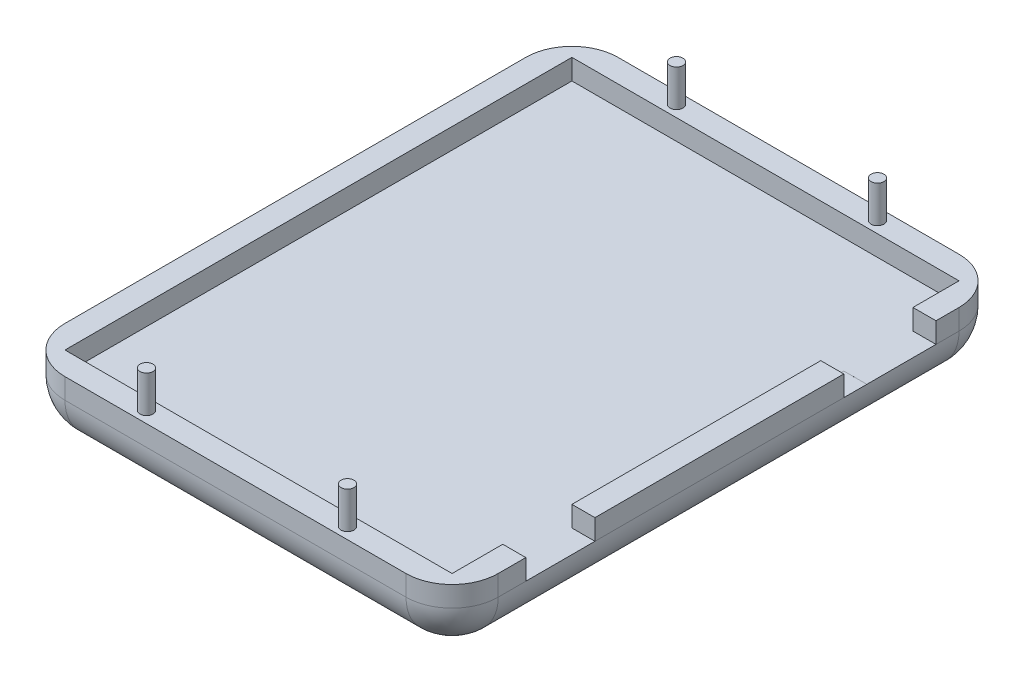
ISO-10303-21;
HEADER;
FILE_DESCRIPTION(('STEP AP214'),'2;1');
FILE_NAME('part.step','',(''),(''),'','','');
FILE_SCHEMA(('AUTOMOTIVE_DESIGN { 1 0 10303 214 1 1 1 1 }'));
ENDSEC;
DATA;
#1=APPLICATION_CONTEXT('core data for automotive mechanical design processes');
#2=APPLICATION_PROTOCOL_DEFINITION('international standard','automotive_design',2000,#1);
#3=PRODUCT_CONTEXT('',#1,'mechanical');
#4=PRODUCT('Part','Part','',(#3));
#5=PRODUCT_RELATED_PRODUCT_CATEGORY('part','',(#4));
#6=PRODUCT_DEFINITION_FORMATION('','',#4);
#7=PRODUCT_DEFINITION_CONTEXT('part definition',#1,'design');
#8=PRODUCT_DEFINITION('design','',#6,#7);
#9=PRODUCT_DEFINITION_SHAPE('','',#8);
#10=(LENGTH_UNIT() NAMED_UNIT(*) SI_UNIT(.MILLI.,.METRE.));
#11=(NAMED_UNIT(*) PLANE_ANGLE_UNIT() SI_UNIT($,.RADIAN.));
#12=(NAMED_UNIT(*) SI_UNIT($,.STERADIAN.) SOLID_ANGLE_UNIT());
#13=UNCERTAINTY_MEASURE_WITH_UNIT(LENGTH_MEASURE(1.E-05),#10,'distance_accuracy_value','');
#14=(GEOMETRIC_REPRESENTATION_CONTEXT(3) GLOBAL_UNCERTAINTY_ASSIGNED_CONTEXT((#13)) GLOBAL_UNIT_ASSIGNED_CONTEXT((#10,
#11,#12)) REPRESENTATION_CONTEXT('',''));
#15=CARTESIAN_POINT('',(0.,0.,0.));
#16=DIRECTION('',(0.,0.,1.));
#17=DIRECTION('',(1.,0.,0.));
#18=AXIS2_PLACEMENT_3D('',#15,#16,#17);
#19=CARTESIAN_POINT('',(84.,10.,120.));
#20=DIRECTION('',(0.,0.,1.));
#21=DIRECTION('',(1.,0.,0.));
#22=AXIS2_PLACEMENT_3D('',#19,#20,#21);
#23=CYLINDRICAL_SURFACE('',#22,10.);
#24=DIRECTION('',(0.,0.,-1.));
#25=VECTOR('',#24,1.);
#26=CARTESIAN_POINT('',(94.,10.,9.99999999999999));
#27=LINE('',#26,#25);
#28=CARTESIAN_POINT('',(94.,10.,89.));
#29=VERTEX_POINT('',#28);
#30=CARTESIAN_POINT('',(94.,10.,35.));
#31=VERTEX_POINT('',#30);
#32=EDGE_CURVE('E57',#29,#31,#27,.T.);
#33=ORIENTED_EDGE('',*,*,#32,.F.);
#34=DIRECTION('',(0.,0.,-1.));
#35=VECTOR('',#34,1.);
#36=CARTESIAN_POINT('',(94.,10.,120.));
#37=LINE('',#36,#35);
#38=CARTESIAN_POINT('',(94.,10.,104.));
#39=VERTEX_POINT('',#38);
#40=EDGE_CURVE('E336',#39,#29,#37,.T.);
#41=ORIENTED_EDGE('',*,*,#40,.F.);
#42=DIRECTION('',(0.,0.,-1.));
#43=VECTOR('',#42,1.);
#44=CARTESIAN_POINT('',(94.,10.,9.99999999999999));
#45=LINE('',#44,#43);
#46=CARTESIAN_POINT('',(94.,10.,110.));
#47=VERTEX_POINT('',#46);
#48=EDGE_CURVE('E410',#47,#39,#45,.T.);
#49=ORIENTED_EDGE('',*,*,#48,.F.);
#50=CARTESIAN_POINT('',(84.,10.,110.));
#51=DIRECTION('',(0.,0.,-1.));
#52=DIRECTION('',(-1.,0.,0.));
#53=AXIS2_PLACEMENT_3D('',#50,#51,#52);
#54=CIRCLE('',#53,10.);
#55=CARTESIAN_POINT('',(84.,0.,110.));
#56=VERTEX_POINT('',#55);
#57=EDGE_CURVE('E435',#47,#56,#54,.T.);
#58=ORIENTED_EDGE('',*,*,#57,.T.);
#59=DIRECTION('',(0.,0.,-1.));
#60=VECTOR('',#59,1.);
#61=CARTESIAN_POINT('',(84.,0.,110.));
#62=LINE('',#61,#60);
#63=CARTESIAN_POINT('',(84.,0.,9.99999999999999));
#64=VERTEX_POINT('',#63);
#65=EDGE_CURVE('E390',#64,#56,#62,.F.);
#66=ORIENTED_EDGE('',*,*,#65,.F.);
#67=CARTESIAN_POINT('',(84.,10.,9.99999999999999));
#68=DIRECTION('',(0.,0.,-1.));
#69=DIRECTION('',(-1.,0.,0.));
#70=AXIS2_PLACEMENT_3D('',#67,#68,#69);
#71=CIRCLE('',#70,10.);
#72=CARTESIAN_POINT('',(94.,10.,9.99999999999999));
#73=VERTEX_POINT('',#72);
#74=EDGE_CURVE('E429',#73,#64,#71,.T.);
#75=ORIENTED_EDGE('',*,*,#74,.F.);
#76=DIRECTION('',(0.,0.,-1.));
#77=VECTOR('',#76,1.);
#78=CARTESIAN_POINT('',(94.,10.,9.99999999999999));
#79=LINE('',#78,#77);
#80=CARTESIAN_POINT('',(94.,10.,15.));
#81=VERTEX_POINT('',#80);
#82=EDGE_CURVE('E407',#81,#73,#79,.T.);
#83=ORIENTED_EDGE('',*,*,#82,.F.);
#84=DIRECTION('',(0.,0.,1.));
#85=VECTOR('',#84,1.);
#86=CARTESIAN_POINT('',(94.,10.,120.));
#87=LINE('',#86,#85);
#88=CARTESIAN_POINT('',(94.,10.,30.));
#89=VERTEX_POINT('',#88);
#90=EDGE_CURVE('E327',#81,#89,#87,.T.);
#91=ORIENTED_EDGE('',*,*,#90,.T.);
#92=DIRECTION('',(0.,1.,0.));
#93=VECTOR('',#92,1.);
#94=CARTESIAN_POINT('',(94.,9.99645236657145,30.));
#95=LINE('',#94,#93);
#96=CARTESIAN_POINT('',(94.,9.99645236657145,30.));
#97=VERTEX_POINT('',#96);
#98=EDGE_CURVE('E248',#97,#89,#95,.T.);
#99=ORIENTED_EDGE('',*,*,#98,.F.);
#100=DIRECTION('',(0.,0.,1.));
#101=VECTOR('',#100,1.);
#102=CARTESIAN_POINT('',(94.,9.99645236657145,30.));
#103=LINE('',#102,#101);
#104=CARTESIAN_POINT('',(94.,9.99645236657145,35.));
#105=VERTEX_POINT('',#104);
#106=EDGE_CURVE('E237',#97,#105,#103,.T.);
#107=ORIENTED_EDGE('',*,*,#106,.T.);
#108=DIRECTION('',(0.,1.,0.));
#109=VECTOR('',#108,1.);
#110=CARTESIAN_POINT('',(94.,9.99645236657145,35.));
#111=LINE('',#110,#109);
#112=EDGE_CURVE('E250',#105,#31,#111,.T.);
#113=ORIENTED_EDGE('',*,*,#112,.T.);
#114=EDGE_LOOP('',(#33,#41,#49,#58,#66,#75,#83,#91,#99,#107,#113));
#115=FACE_BOUND('',#114,.T.);
#116=ADVANCED_FACE('F35',(#115),#23,.T.);
#117=CARTESIAN_POINT('',(94.,30.,120.));
#118=DIRECTION('',(1.,0.,0.));
#119=DIRECTION('',(0.,0.,-1.));
#120=AXIS2_PLACEMENT_3D('',#117,#118,#119);
#121=PLANE('',#120);
#122=DIRECTION('',(0.,-1.,0.));
#123=VECTOR('',#122,1.);
#124=CARTESIAN_POINT('',(94.,30.,104.));
#125=LINE('',#124,#123);
#126=CARTESIAN_POINT('',(94.,14.4464523665714,104.));
#127=VERTEX_POINT('',#126);
#128=EDGE_CURVE('E338',#127,#39,#125,.T.);
#129=ORIENTED_EDGE('',*,*,#128,.F.);
#130=DIRECTION('',(0.,0.,1.));
#131=VECTOR('',#130,1.);
#132=CARTESIAN_POINT('',(94.,14.4464523665714,120.));
#133=LINE('',#132,#131);
#134=CARTESIAN_POINT('',(94.,14.4464523665714,110.));
#135=VERTEX_POINT('',#134);
#136=EDGE_CURVE('E296',#127,#135,#133,.T.);
#137=ORIENTED_EDGE('',*,*,#136,.T.);
#138=DIRECTION('',(0.,-1.,0.));
#139=VECTOR('',#138,1.);
#140=CARTESIAN_POINT('',(94.,0.,110.));
#141=LINE('',#140,#139);
#142=EDGE_CURVE('E381',#135,#47,#141,.T.);
#143=ORIENTED_EDGE('',*,*,#142,.T.);
#144=ORIENTED_EDGE('',*,*,#48,.T.);
#145=EDGE_LOOP('',(#129,#137,#143,#144));
#146=FACE_BOUND('',#145,.T.);
#147=ADVANCED_FACE('F506',(#146),#121,.T.);
#148=CARTESIAN_POINT('',(94.,14.4464523665714,35.));
#149=VERTEX_POINT('',#148);
#150=EDGE_CURVE('E210',#31,#149,#111,.T.);
#151=ORIENTED_EDGE('',*,*,#150,.T.);
#152=DIRECTION('',(0.,0.,1.));
#153=VECTOR('',#152,1.);
#154=CARTESIAN_POINT('',(94.,14.4464523665714,120.));
#155=LINE('',#154,#153);
#156=CARTESIAN_POINT('',(94.,14.4464523665714,89.));
#157=VERTEX_POINT('',#156);
#158=EDGE_CURVE('E206',#149,#157,#155,.T.);
#159=ORIENTED_EDGE('',*,*,#158,.T.);
#160=DIRECTION('',(0.,1.,0.));
#161=VECTOR('',#160,1.);
#162=CARTESIAN_POINT('',(94.,9.99645236657145,89.));
#163=LINE('',#162,#161);
#164=EDGE_CURVE('E209',#29,#157,#163,.T.);
#165=ORIENTED_EDGE('',*,*,#164,.F.);
#166=ORIENTED_EDGE('',*,*,#32,.T.);
#167=EDGE_LOOP('',(#151,#159,#165,#166));
#168=FACE_BOUND('',#167,.T.);
#169=ADVANCED_FACE('F208',(#168),#121,.T.);
#170=CARTESIAN_POINT('',(89.,10.,115.));
#171=DIRECTION('',(1.,0.,0.));
#172=DIRECTION('',(0.,0.,-1.));
#173=AXIS2_PLACEMENT_3D('',#170,#171,#172);
#174=PLANE('',#173);
#175=DIRECTION('',(0.,0.,1.));
#176=VECTOR('',#175,1.);
#177=CARTESIAN_POINT('',(89.,14.4464523665714,115.));
#178=LINE('',#177,#176);
#179=CARTESIAN_POINT('',(89.,14.4464523665714,5.));
#180=VERTEX_POINT('',#179);
#181=CARTESIAN_POINT('',(89.,14.4464523665714,15.));
#182=VERTEX_POINT('',#181);
#183=EDGE_CURVE('E282',#180,#182,#178,.T.);
#184=ORIENTED_EDGE('',*,*,#183,.F.);
#185=DIRECTION('',(0.,1.,0.));
#186=VECTOR('',#185,1.);
#187=CARTESIAN_POINT('',(89.,10.,5.));
#188=LINE('',#187,#186);
#189=CARTESIAN_POINT('',(89.,10.,5.));
#190=VERTEX_POINT('',#189);
#191=EDGE_CURVE('E359',#190,#180,#188,.T.);
#192=ORIENTED_EDGE('',*,*,#191,.F.);
#193=DIRECTION('',(0.,0.,-1.));
#194=VECTOR('',#193,1.);
#195=CARTESIAN_POINT('',(89.,10.,115.));
#196=LINE('',#195,#194);
#197=CARTESIAN_POINT('',(89.,10.,15.));
#198=VERTEX_POINT('',#197);
#199=EDGE_CURVE('E346',#198,#190,#196,.T.);
#200=ORIENTED_EDGE('',*,*,#199,.F.);
#201=DIRECTION('',(0.,1.,0.));
#202=VECTOR('',#201,1.);
#203=CARTESIAN_POINT('',(89.,10.,15.));
#204=LINE('',#203,#202);
#205=EDGE_CURVE('E321',#198,#182,#204,.T.);
#206=ORIENTED_EDGE('',*,*,#205,.T.);
#207=EDGE_LOOP('',(#184,#192,#200,#206));
#208=FACE_BOUND('',#207,.T.);
#209=ADVANCED_FACE('F516',(#208),#174,.F.);
#210=DIRECTION('',(0.,-1.,0.));
#211=VECTOR('',#210,1.);
#212=CARTESIAN_POINT('',(94.,30.,9.99999999999999));
#213=LINE('',#212,#211);
#214=CARTESIAN_POINT('',(94.,14.4464523665714,9.99999999999999));
#215=VERTEX_POINT('',#214);
#216=EDGE_CURVE('E378',#73,#215,#213,.F.);
#217=ORIENTED_EDGE('',*,*,#216,.T.);
#218=DIRECTION('',(0.,0.,1.));
#219=VECTOR('',#218,1.);
#220=CARTESIAN_POINT('',(94.,14.4464523665714,120.));
#221=LINE('',#220,#219);
#222=CARTESIAN_POINT('',(94.,14.4464523665714,15.));
#223=VERTEX_POINT('',#222);
#224=EDGE_CURVE('E277',#215,#223,#221,.T.);
#225=ORIENTED_EDGE('',*,*,#224,.T.);
#226=DIRECTION('',(0.,1.,0.));
#227=VECTOR('',#226,1.);
#228=CARTESIAN_POINT('',(94.,30.,15.));
#229=LINE('',#228,#227);
#230=EDGE_CURVE('E324',#81,#223,#229,.T.);
#231=ORIENTED_EDGE('',*,*,#230,.F.);
#232=ORIENTED_EDGE('',*,*,#82,.T.);
#233=EDGE_LOOP('',(#217,#225,#231,#232));
#234=FACE_BOUND('',#233,.T.);
#235=ADVANCED_FACE('F512',(#234),#121,.T.);
#236=DIRECTION('',(0.,0.,1.));
#237=VECTOR('',#236,1.);
#238=CARTESIAN_POINT('',(89.,14.4464523665714,115.));
#239=LINE('',#238,#237);
#240=CARTESIAN_POINT('',(89.,14.4464523665714,35.));
#241=VERTEX_POINT('',#240);
#242=CARTESIAN_POINT('',(89.,14.4464523665714,89.));
#243=VERTEX_POINT('',#242);
#244=EDGE_CURVE('E215',#241,#243,#239,.T.);
#245=ORIENTED_EDGE('',*,*,#244,.F.);
#246=DIRECTION('',(0.,1.,0.));
#247=VECTOR('',#246,1.);
#248=CARTESIAN_POINT('',(89.,9.99645236657145,35.));
#249=LINE('',#248,#247);
#250=CARTESIAN_POINT('',(89.,10.,35.));
#251=VERTEX_POINT('',#250);
#252=EDGE_CURVE('E242',#251,#241,#249,.T.);
#253=ORIENTED_EDGE('',*,*,#252,.F.);
#254=CARTESIAN_POINT('',(89.,10.,89.));
#255=VERTEX_POINT('',#254);
#256=EDGE_CURVE('E50',#255,#251,#196,.T.);
#257=ORIENTED_EDGE('',*,*,#256,.F.);
#258=DIRECTION('',(0.,1.,0.));
#259=VECTOR('',#258,1.);
#260=CARTESIAN_POINT('',(89.,9.99645236657145,89.));
#261=LINE('',#260,#259);
#262=EDGE_CURVE('E224',#255,#243,#261,.T.);
#263=ORIENTED_EDGE('',*,*,#262,.T.);
#264=EDGE_LOOP('',(#245,#253,#257,#263));
#265=FACE_BOUND('',#264,.T.);
#266=ADVANCED_FACE('F521',(#265),#174,.F.);
#267=CARTESIAN_POINT('',(0.,0.,120.));
#268=DIRECTION('',(-1.,0.,0.));
#269=DIRECTION('',(0.,0.,1.));
#270=AXIS2_PLACEMENT_3D('',#267,#268,#269);
#271=PLANE('',#270);
#272=DIRECTION('',(0.,1.,0.));
#273=VECTOR('',#272,1.);
#274=CARTESIAN_POINT('',(0.,30.,110.));
#275=LINE('',#274,#273);
#276=CARTESIAN_POINT('',(0.,10.,110.));
#277=VERTEX_POINT('',#276);
#278=CARTESIAN_POINT('',(0.,14.4464523665714,110.));
#279=VERTEX_POINT('',#278);
#280=EDGE_CURVE('E370',#277,#279,#275,.T.);
#281=ORIENTED_EDGE('',*,*,#280,.T.);
#282=DIRECTION('',(0.,0.,-1.));
#283=VECTOR('',#282,1.);
#284=CARTESIAN_POINT('',(0.,14.4464523665714,120.));
#285=LINE('',#284,#283);
#286=CARTESIAN_POINT('',(0.,14.4464523665714,9.99999999999999));
#287=VERTEX_POINT('',#286);
#288=EDGE_CURVE('E307',#279,#287,#285,.T.);
#289=ORIENTED_EDGE('',*,*,#288,.T.);
#290=DIRECTION('',(0.,1.,0.));
#291=VECTOR('',#290,1.);
#292=CARTESIAN_POINT('',(0.,0.,9.99999999999999));
#293=LINE('',#292,#291);
#294=CARTESIAN_POINT('',(0.,10.,9.99999999999999));
#295=VERTEX_POINT('',#294);
#296=EDGE_CURVE('E368',#287,#295,#293,.F.);
#297=ORIENTED_EDGE('',*,*,#296,.T.);
#298=DIRECTION('',(0.,0.,-1.));
#299=VECTOR('',#298,1.);
#300=CARTESIAN_POINT('',(0.,10.,110.));
#301=LINE('',#300,#299);
#302=EDGE_CURVE('E397',#295,#277,#301,.F.);
#303=ORIENTED_EDGE('',*,*,#302,.T.);
#304=EDGE_LOOP('',(#281,#289,#297,#303));
#305=FACE_BOUND('',#304,.T.);
#306=ADVANCED_FACE('F467',(#305),#271,.T.);
#307=CARTESIAN_POINT('',(0.,0.,120.));
#308=DIRECTION('',(0.,0.,-1.));
#309=DIRECTION('',(-1.,0.,0.));
#310=AXIS2_PLACEMENT_3D('',#307,#308,#309);
#311=PLANE('',#310);
#312=DIRECTION('',(1.,0.,0.));
#313=VECTOR('',#312,1.);
#314=CARTESIAN_POINT('',(0.,14.4464523665714,120.));
#315=LINE('',#314,#313);
#316=CARTESIAN_POINT('',(10.,14.4464523665714,120.));
#317=VERTEX_POINT('',#316);
#318=CARTESIAN_POINT('',(84.,14.4464523665714,120.));
#319=VERTEX_POINT('',#318);
#320=EDGE_CURVE('E302',#317,#319,#315,.T.);
#321=ORIENTED_EDGE('',*,*,#320,.F.);
#322=DIRECTION('',(0.,1.,0.));
#323=VECTOR('',#322,1.);
#324=CARTESIAN_POINT('',(10.,0.,120.));
#325=LINE('',#324,#323);
#326=CARTESIAN_POINT('',(10.,10.,120.));
#327=VERTEX_POINT('',#326);
#328=EDGE_CURVE('E376',#317,#327,#325,.F.);
#329=ORIENTED_EDGE('',*,*,#328,.T.);
#330=DIRECTION('',(1.,0.,0.));
#331=VECTOR('',#330,1.);
#332=CARTESIAN_POINT('',(0.,10.,120.));
#333=LINE('',#332,#331);
#334=CARTESIAN_POINT('',(84.,10.,120.));
#335=VERTEX_POINT('',#334);
#336=EDGE_CURVE('E402',#327,#335,#333,.T.);
#337=ORIENTED_EDGE('',*,*,#336,.T.);
#338=DIRECTION('',(0.,-1.,0.));
#339=VECTOR('',#338,1.);
#340=CARTESIAN_POINT('',(84.,30.,120.));
#341=LINE('',#340,#339);
#342=EDGE_CURVE('E373',#335,#319,#341,.F.);
#343=ORIENTED_EDGE('',*,*,#342,.T.);
#344=EDGE_LOOP('',(#321,#329,#337,#343));
#345=FACE_BOUND('',#344,.T.);
#346=ADVANCED_FACE('F548',(#345),#311,.F.);
#347=CARTESIAN_POINT('',(0.,0.,0.));
#348=DIRECTION('',(0.,0.,-1.));
#349=DIRECTION('',(-1.,0.,0.));
#350=AXIS2_PLACEMENT_3D('',#347,#348,#349);
#351=PLANE('',#350);
#352=DIRECTION('',(0.,1.,0.));
#353=VECTOR('',#352,1.);
#354=CARTESIAN_POINT('',(10.,0.,0.));
#355=LINE('',#354,#353);
#356=CARTESIAN_POINT('',(10.,10.,0.));
#357=VERTEX_POINT('',#356);
#358=CARTESIAN_POINT('',(9.99999999999999,14.4464523665714,0.));
#359=VERTEX_POINT('',#358);
#360=EDGE_CURVE('E365',#357,#359,#355,.T.);
#361=ORIENTED_EDGE('',*,*,#360,.T.);
#362=DIRECTION('',(-1.,0.,0.));
#363=VECTOR('',#362,1.);
#364=CARTESIAN_POINT('',(105.,14.4464523665714,0.));
#365=LINE('',#364,#363);
#366=CARTESIAN_POINT('',(84.,14.4464523665714,0.));
#367=VERTEX_POINT('',#366);
#368=EDGE_CURVE('E273',#367,#359,#365,.T.);
#369=ORIENTED_EDGE('',*,*,#368,.F.);
#370=DIRECTION('',(0.,-1.,0.));
#371=VECTOR('',#370,1.);
#372=CARTESIAN_POINT('',(84.,0.,0.));
#373=LINE('',#372,#371);
#374=CARTESIAN_POINT('',(84.,10.,0.));
#375=VERTEX_POINT('',#374);
#376=EDGE_CURVE('E383',#367,#375,#373,.T.);
#377=ORIENTED_EDGE('',*,*,#376,.T.);
#378=DIRECTION('',(1.,0.,0.));
#379=VECTOR('',#378,1.);
#380=CARTESIAN_POINT('',(10.,10.,0.));
#381=LINE('',#380,#379);
#382=EDGE_CURVE('E416',#375,#357,#381,.F.);
#383=ORIENTED_EDGE('',*,*,#382,.T.);
#384=EDGE_LOOP('',(#361,#369,#377,#383));
#385=FACE_BOUND('',#384,.T.);
#386=ADVANCED_FACE('F639',(#385),#351,.T.);
#387=CARTESIAN_POINT('',(5.,10.,115.));
#388=DIRECTION('',(1.,0.,0.));
#389=DIRECTION('',(0.,0.,-1.));
#390=AXIS2_PLACEMENT_3D('',#387,#388,#389);
#391=PLANE('',#390);
#392=DIRECTION('',(0.,1.,0.));
#393=VECTOR('',#392,1.);
#394=CARTESIAN_POINT('',(4.99999999999999,10.,5.));
#395=LINE('',#394,#393);
#396=CARTESIAN_POINT('',(4.99999999999999,10.,5.));
#397=VERTEX_POINT('',#396);
#398=CARTESIAN_POINT('',(4.99999999999999,14.4464523665714,5.));
#399=VERTEX_POINT('',#398);
#400=EDGE_CURVE('E362',#397,#399,#395,.T.);
#401=ORIENTED_EDGE('',*,*,#400,.T.);
#402=DIRECTION('',(0.,0.,1.));
#403=VECTOR('',#402,1.);
#404=CARTESIAN_POINT('',(5.,14.4464523665714,115.));
#405=LINE('',#404,#403);
#406=CARTESIAN_POINT('',(5.,14.4464523665714,115.));
#407=VERTEX_POINT('',#406);
#408=EDGE_CURVE('E287',#399,#407,#405,.T.);
#409=ORIENTED_EDGE('',*,*,#408,.T.);
#410=DIRECTION('',(0.,1.,0.));
#411=VECTOR('',#410,1.);
#412=CARTESIAN_POINT('',(5.,10.,115.));
#413=LINE('',#412,#411);
#414=CARTESIAN_POINT('',(5.,10.,115.));
#415=VERTEX_POINT('',#414);
#416=EDGE_CURVE('E353',#415,#407,#413,.T.);
#417=ORIENTED_EDGE('',*,*,#416,.F.);
#418=DIRECTION('',(0.,0.,-1.));
#419=VECTOR('',#418,1.);
#420=CARTESIAN_POINT('',(5.,10.,115.));
#421=LINE('',#420,#419);
#422=EDGE_CURVE('E340',#415,#397,#421,.T.);
#423=ORIENTED_EDGE('',*,*,#422,.T.);
#424=EDGE_LOOP('',(#401,#409,#417,#423));
#425=FACE_BOUND('',#424,.T.);
#426=ADVANCED_FACE('F561',(#425),#391,.T.);
#427=CARTESIAN_POINT('',(4.99999999999999,10.,5.));
#428=DIRECTION('',(0.,0.,1.));
#429=DIRECTION('',(1.,0.,0.));
#430=AXIS2_PLACEMENT_3D('',#427,#428,#429);
#431=PLANE('',#430);
#432=ORIENTED_EDGE('',*,*,#191,.T.);
#433=DIRECTION('',(-1.,0.,0.));
#434=VECTOR('',#433,1.);
#435=CARTESIAN_POINT('',(4.99999999999999,14.4464523665714,5.));
#436=LINE('',#435,#434);
#437=EDGE_CURVE('E284',#180,#399,#436,.T.);
#438=ORIENTED_EDGE('',*,*,#437,.T.);
#439=ORIENTED_EDGE('',*,*,#400,.F.);
#440=DIRECTION('',(1.,0.,0.));
#441=VECTOR('',#440,1.);
#442=CARTESIAN_POINT('',(4.99999999999999,10.,5.));
#443=LINE('',#442,#441);
#444=EDGE_CURVE('E343',#397,#190,#443,.T.);
#445=ORIENTED_EDGE('',*,*,#444,.T.);
#446=EDGE_LOOP('',(#432,#438,#439,#445));
#447=FACE_BOUND('',#446,.T.);
#448=ADVANCED_FACE('F565',(#447),#431,.T.);
#449=DIRECTION('',(0.,0.,1.));
#450=VECTOR('',#449,1.);
#451=CARTESIAN_POINT('',(89.,14.4464523665714,115.));
#452=LINE('',#451,#450);
#453=CARTESIAN_POINT('',(89.,14.4464523665714,104.));
#454=VERTEX_POINT('',#453);
#455=CARTESIAN_POINT('',(89.,14.4464523665714,115.));
#456=VERTEX_POINT('',#455);
#457=EDGE_CURVE('E292',#454,#456,#452,.T.);
#458=ORIENTED_EDGE('',*,*,#457,.F.);
#459=DIRECTION('',(0.,1.,0.));
#460=VECTOR('',#459,1.);
#461=CARTESIAN_POINT('',(89.,10.,104.));
#462=LINE('',#461,#460);
#463=CARTESIAN_POINT('',(89.,10.,104.));
#464=VERTEX_POINT('',#463);
#465=EDGE_CURVE('E333',#464,#454,#462,.T.);
#466=ORIENTED_EDGE('',*,*,#465,.F.);
#467=CARTESIAN_POINT('',(89.,10.,115.));
#468=VERTEX_POINT('',#467);
#469=EDGE_CURVE('E347',#468,#464,#196,.T.);
#470=ORIENTED_EDGE('',*,*,#469,.F.);
#471=DIRECTION('',(0.,1.,0.));
#472=VECTOR('',#471,1.);
#473=CARTESIAN_POINT('',(89.,10.,115.));
#474=LINE('',#473,#472);
#475=EDGE_CURVE('E356',#468,#456,#474,.T.);
#476=ORIENTED_EDGE('',*,*,#475,.T.);
#477=EDGE_LOOP('',(#458,#466,#470,#476));
#478=FACE_BOUND('',#477,.T.);
#479=ADVANCED_FACE('F528',(#478),#174,.F.);
#480=CARTESIAN_POINT('',(5.,10.,115.));
#481=DIRECTION('',(0.,0.,1.));
#482=DIRECTION('',(1.,0.,0.));
#483=AXIS2_PLACEMENT_3D('',#480,#481,#482);
#484=PLANE('',#483);
#485=DIRECTION('',(-1.,0.,0.));
#486=VECTOR('',#485,1.);
#487=CARTESIAN_POINT('',(5.,14.4464523665714,115.));
#488=LINE('',#487,#486);
#489=EDGE_CURVE('E290',#456,#407,#488,.T.);
#490=ORIENTED_EDGE('',*,*,#489,.F.);
#491=ORIENTED_EDGE('',*,*,#475,.F.);
#492=DIRECTION('',(1.,0.,0.));
#493=VECTOR('',#492,1.);
#494=CARTESIAN_POINT('',(5.,10.,115.));
#495=LINE('',#494,#493);
#496=EDGE_CURVE('E350',#415,#468,#495,.T.);
#497=ORIENTED_EDGE('',*,*,#496,.F.);
#498=ORIENTED_EDGE('',*,*,#416,.T.);
#499=EDGE_LOOP('',(#490,#491,#497,#498));
#500=FACE_BOUND('',#499,.T.);
#501=ADVANCED_FACE('F559',(#500),#484,.F.);
#502=CARTESIAN_POINT('',(89.,10.,104.));
#503=DIRECTION('',(0.,0.,1.));
#504=DIRECTION('',(1.,0.,0.));
#505=AXIS2_PLACEMENT_3D('',#502,#503,#504);
#506=PLANE('',#505);
#507=DIRECTION('',(-1.,0.,0.));
#508=VECTOR('',#507,1.);
#509=CARTESIAN_POINT('',(89.,14.4464523665714,104.));
#510=LINE('',#509,#508);
#511=EDGE_CURVE('E294',#127,#454,#510,.T.);
#512=ORIENTED_EDGE('',*,*,#511,.F.);
#513=ORIENTED_EDGE('',*,*,#128,.T.);
#514=DIRECTION('',(1.,0.,0.));
#515=VECTOR('',#514,1.);
#516=CARTESIAN_POINT('',(89.,10.,104.));
#517=LINE('',#516,#515);
#518=EDGE_CURVE('E330',#464,#39,#517,.T.);
#519=ORIENTED_EDGE('',*,*,#518,.F.);
#520=ORIENTED_EDGE('',*,*,#465,.T.);
#521=EDGE_LOOP('',(#512,#513,#519,#520));
#522=FACE_BOUND('',#521,.T.);
#523=ADVANCED_FACE('F551',(#522),#506,.F.);
#524=CARTESIAN_POINT('',(89.,10.,15.));
#525=DIRECTION('',(0.,0.,-1.));
#526=DIRECTION('',(-1.,0.,0.));
#527=AXIS2_PLACEMENT_3D('',#524,#525,#526);
#528=PLANE('',#527);
#529=DIRECTION('',(1.,0.,0.));
#530=VECTOR('',#529,1.);
#531=CARTESIAN_POINT('',(89.,14.4464523665714,15.));
#532=LINE('',#531,#530);
#533=EDGE_CURVE('E280',#182,#223,#532,.T.);
#534=ORIENTED_EDGE('',*,*,#533,.F.);
#535=ORIENTED_EDGE('',*,*,#205,.F.);
#536=DIRECTION('',(-1.,0.,0.));
#537=VECTOR('',#536,1.);
#538=CARTESIAN_POINT('',(89.,10.,15.));
#539=LINE('',#538,#537);
#540=EDGE_CURVE('E317',#81,#198,#539,.T.);
#541=ORIENTED_EDGE('',*,*,#540,.F.);
#542=ORIENTED_EDGE('',*,*,#230,.T.);
#543=EDGE_LOOP('',(#534,#535,#541,#542));
#544=FACE_BOUND('',#543,.T.);
#545=ADVANCED_FACE('F572',(#544),#528,.F.);
#546=CARTESIAN_POINT('',(10.,0.,10.));
#547=DIRECTION('',(0.,1.,0.));
#548=DIRECTION('',(0.,0.,1.));
#549=AXIS2_PLACEMENT_3D('',#546,#547,#548);
#550=CYLINDRICAL_SURFACE('',#549,10.);
#551=ORIENTED_EDGE('',*,*,#296,.F.);
#552=CARTESIAN_POINT('',(10.,14.4464523665714,10.));
#553=DIRECTION('',(0.,1.,0.));
#554=DIRECTION('',(0.,0.,1.));
#555=AXIS2_PLACEMENT_3D('',#552,#553,#554);
#556=CIRCLE('',#555,10.);
#557=EDGE_CURVE('E310',#287,#359,#556,.F.);
#558=ORIENTED_EDGE('',*,*,#557,.T.);
#559=ORIENTED_EDGE('',*,*,#360,.F.);
#560=CARTESIAN_POINT('',(10.,10.,10.));
#561=DIRECTION('',(0.,1.,0.));
#562=DIRECTION('',(0.,0.,1.));
#563=AXIS2_PLACEMENT_3D('',#560,#561,#562);
#564=CIRCLE('',#563,10.);
#565=EDGE_CURVE('E385',#357,#295,#564,.T.);
#566=ORIENTED_EDGE('',*,*,#565,.T.);
#567=EDGE_LOOP('',(#551,#558,#559,#566));
#568=FACE_BOUND('',#567,.T.);
#569=ADVANCED_FACE('F478',(#568),#550,.T.);
#570=CARTESIAN_POINT('',(10.,0.,110.));
#571=DIRECTION('',(0.,-1.,0.));
#572=DIRECTION('',(0.,0.,-1.));
#573=AXIS2_PLACEMENT_3D('',#570,#571,#572);
#574=CYLINDRICAL_SURFACE('',#573,10.);
#575=ORIENTED_EDGE('',*,*,#328,.F.);
#576=CARTESIAN_POINT('',(10.,14.4464523665714,110.));
#577=DIRECTION('',(0.,1.,0.));
#578=DIRECTION('',(0.,0.,1.));
#579=AXIS2_PLACEMENT_3D('',#576,#577,#578);
#580=CIRCLE('',#579,10.);
#581=EDGE_CURVE('E304',#317,#279,#580,.F.);
#582=ORIENTED_EDGE('',*,*,#581,.T.);
#583=ORIENTED_EDGE('',*,*,#280,.F.);
#584=CARTESIAN_POINT('',(10.,10.,110.));
#585=DIRECTION('',(0.,-1.,0.));
#586=DIRECTION('',(0.,0.,-1.));
#587=AXIS2_PLACEMENT_3D('',#584,#585,#586);
#588=CIRCLE('',#587,10.);
#589=EDGE_CURVE('E399',#277,#327,#588,.F.);
#590=ORIENTED_EDGE('',*,*,#589,.T.);
#591=EDGE_LOOP('',(#575,#582,#583,#590));
#592=FACE_BOUND('',#591,.T.);
#593=ADVANCED_FACE('F465',(#592),#574,.T.);
#594=CARTESIAN_POINT('',(84.,30.,110.));
#595=DIRECTION('',(0.,1.,0.));
#596=DIRECTION('',(0.,0.,1.));
#597=AXIS2_PLACEMENT_3D('',#594,#595,#596);
#598=CYLINDRICAL_SURFACE('',#597,10.);
#599=ORIENTED_EDGE('',*,*,#142,.F.);
#600=CARTESIAN_POINT('',(84.,14.4464523665714,110.));
#601=DIRECTION('',(0.,1.,0.));
#602=DIRECTION('',(0.,0.,1.));
#603=AXIS2_PLACEMENT_3D('',#600,#601,#602);
#604=CIRCLE('',#603,10.);
#605=EDGE_CURVE('E299',#135,#319,#604,.F.);
#606=ORIENTED_EDGE('',*,*,#605,.T.);
#607=ORIENTED_EDGE('',*,*,#342,.F.);
#608=CARTESIAN_POINT('',(84.,10.,110.));
#609=DIRECTION('',(0.,1.,0.));
#610=DIRECTION('',(0.,0.,1.));
#611=AXIS2_PLACEMENT_3D('',#608,#609,#610);
#612=CIRCLE('',#611,10.);
#613=EDGE_CURVE('E404',#335,#47,#612,.T.);
#614=ORIENTED_EDGE('',*,*,#613,.T.);
#615=EDGE_LOOP('',(#599,#606,#607,#614));
#616=FACE_BOUND('',#615,.T.);
#617=ADVANCED_FACE('F546',(#616),#598,.T.);
#618=CARTESIAN_POINT('',(84.,0.,10.));
#619=DIRECTION('',(0.,-1.,0.));
#620=DIRECTION('',(0.,0.,-1.));
#621=AXIS2_PLACEMENT_3D('',#618,#619,#620);
#622=CYLINDRICAL_SURFACE('',#621,10.);
#623=ORIENTED_EDGE('',*,*,#376,.F.);
#624=CARTESIAN_POINT('',(84.,14.4464523665714,10.));
#625=DIRECTION('',(0.,1.,0.));
#626=DIRECTION('',(0.,0.,1.));
#627=AXIS2_PLACEMENT_3D('',#624,#625,#626);
#628=CIRCLE('',#627,10.);
#629=EDGE_CURVE('E418',#367,#215,#628,.F.);
#630=ORIENTED_EDGE('',*,*,#629,.T.);
#631=ORIENTED_EDGE('',*,*,#216,.F.);
#632=CARTESIAN_POINT('',(84.,10.,10.));
#633=DIRECTION('',(0.,-1.,0.));
#634=DIRECTION('',(0.,0.,-1.));
#635=AXIS2_PLACEMENT_3D('',#632,#633,#634);
#636=CIRCLE('',#635,10.);
#637=EDGE_CURVE('E413',#73,#375,#636,.F.);
#638=ORIENTED_EDGE('',*,*,#637,.T.);
#639=EDGE_LOOP('',(#623,#630,#631,#638));
#640=FACE_BOUND('',#639,.T.);
#641=ADVANCED_FACE('F536',(#640),#622,.T.);
#642=CARTESIAN_POINT('',(0.,0.,120.));
#643=DIRECTION('',(0.,1.,0.));
#644=DIRECTION('',(0.,0.,1.));
#645=AXIS2_PLACEMENT_3D('',#642,#643,#644);
#646=PLANE('',#645);
#647=DIRECTION('',(1.,0.,0.));
#648=VECTOR('',#647,1.);
#649=CARTESIAN_POINT('',(0.,0.,110.));
#650=LINE('',#649,#648);
#651=CARTESIAN_POINT('',(10.,0.,110.));
#652=VERTEX_POINT('',#651);
#653=EDGE_CURVE('E392',#56,#652,#650,.F.);
#654=ORIENTED_EDGE('',*,*,#653,.T.);
#655=DIRECTION('',(0.,0.,-1.));
#656=VECTOR('',#655,1.);
#657=CARTESIAN_POINT('',(10.,0.,9.99999999999999));
#658=LINE('',#657,#656);
#659=CARTESIAN_POINT('',(10.,0.,9.99999999999999));
#660=VERTEX_POINT('',#659);
#661=EDGE_CURVE('E394',#652,#660,#658,.T.);
#662=ORIENTED_EDGE('',*,*,#661,.T.);
#663=DIRECTION('',(1.,0.,0.));
#664=VECTOR('',#663,1.);
#665=CARTESIAN_POINT('',(84.,0.,9.99999999999999));
#666=LINE('',#665,#664);
#667=EDGE_CURVE('E388',#660,#64,#666,.T.);
#668=ORIENTED_EDGE('',*,*,#667,.T.);
#669=ORIENTED_EDGE('',*,*,#65,.T.);
#670=EDGE_LOOP('',(#654,#662,#668,#669));
#671=FACE_BOUND('',#670,.T.);
#672=ADVANCED_FACE('F487',(#671),#646,.F.);
#673=CARTESIAN_POINT('',(0.,10.,0.));
#674=DIRECTION('',(0.,-1.,0.));
#675=DIRECTION('',(0.,0.,-1.));
#676=AXIS2_PLACEMENT_3D('',#673,#674,#675);
#677=PLANE('',#676);
#678=ORIENTED_EDGE('',*,*,#40,.T.);
#679=DIRECTION('',(-1.,0.,0.));
#680=VECTOR('',#679,1.);
#681=CARTESIAN_POINT('',(0.,10.,89.));
#682=LINE('',#681,#680);
#683=EDGE_CURVE('E11',#29,#255,#682,.T.);
#684=ORIENTED_EDGE('',*,*,#683,.T.);
#685=ORIENTED_EDGE('',*,*,#256,.T.);
#686=DIRECTION('',(0.,0.,-1.));
#687=VECTOR('',#686,1.);
#688=CARTESIAN_POINT('',(89.,10.,0.));
#689=LINE('',#688,#687);
#690=CARTESIAN_POINT('',(89.,10.,30.));
#691=VERTEX_POINT('',#690);
#692=EDGE_CURVE('E247',#251,#691,#689,.T.);
#693=ORIENTED_EDGE('',*,*,#692,.T.);
#694=DIRECTION('',(1.,0.,0.));
#695=VECTOR('',#694,1.);
#696=CARTESIAN_POINT('',(89.,10.,30.));
#697=LINE('',#696,#695);
#698=EDGE_CURVE('E314',#691,#89,#697,.T.);
#699=ORIENTED_EDGE('',*,*,#698,.T.);
#700=ORIENTED_EDGE('',*,*,#90,.F.);
#701=ORIENTED_EDGE('',*,*,#540,.T.);
#702=ORIENTED_EDGE('',*,*,#199,.T.);
#703=ORIENTED_EDGE('',*,*,#444,.F.);
#704=ORIENTED_EDGE('',*,*,#422,.F.);
#705=ORIENTED_EDGE('',*,*,#496,.T.);
#706=ORIENTED_EDGE('',*,*,#469,.T.);
#707=ORIENTED_EDGE('',*,*,#518,.T.);
#708=EDGE_LOOP('',(#678,#684,#685,#693,#699,#700,#701,#702,#703,#704,#705,#706,#707));
#709=FACE_BOUND('',#708,.T.);
#710=ADVANCED_FACE('F574',(#709),#677,.F.);
#711=CARTESIAN_POINT('',(84.,10.,110.));
#712=DIRECTION('',(0.,1.,0.));
#713=DIRECTION('',(0.,0.,1.));
#714=AXIS2_PLACEMENT_3D('',#711,#712,#713);
#715=SPHERICAL_SURFACE('',#714,10.);
#716=ORIENTED_EDGE('',*,*,#57,.F.);
#717=ORIENTED_EDGE('',*,*,#613,.F.);
#718=CARTESIAN_POINT('',(84.,10.,110.));
#719=DIRECTION('',(-1.,0.,0.));
#720=DIRECTION('',(0.,0.,1.));
#721=AXIS2_PLACEMENT_3D('',#718,#719,#720);
#722=CIRCLE('',#721,10.);
#723=EDGE_CURVE('E318',#56,#335,#722,.T.);
#724=ORIENTED_EDGE('',*,*,#723,.F.);
#725=EDGE_LOOP('',(#716,#717,#724));
#726=FACE_BOUND('',#725,.T.);
#727=ADVANCED_FACE('F37',(#726),#715,.T.);
#728=CARTESIAN_POINT('',(0.,10.,110.));
#729=DIRECTION('',(1.,0.,0.));
#730=DIRECTION('',(0.,0.,-1.));
#731=AXIS2_PLACEMENT_3D('',#728,#729,#730);
#732=CYLINDRICAL_SURFACE('',#731,10.);
#733=ORIENTED_EDGE('',*,*,#723,.T.);
#734=ORIENTED_EDGE('',*,*,#336,.F.);
#735=CARTESIAN_POINT('',(10.,10.,110.));
#736=DIRECTION('',(-1.,0.,0.));
#737=DIRECTION('',(0.,0.,1.));
#738=AXIS2_PLACEMENT_3D('',#735,#736,#737);
#739=CIRCLE('',#738,10.);
#740=EDGE_CURVE('E432',#652,#327,#739,.T.);
#741=ORIENTED_EDGE('',*,*,#740,.F.);
#742=ORIENTED_EDGE('',*,*,#653,.F.);
#743=EDGE_LOOP('',(#733,#734,#741,#742));
#744=FACE_BOUND('',#743,.T.);
#745=ADVANCED_FACE('F492',(#744),#732,.T.);
#746=CARTESIAN_POINT('',(10.,10.,110.));
#747=DIRECTION('',(0.,1.,0.));
#748=DIRECTION('',(0.,0.,1.));
#749=AXIS2_PLACEMENT_3D('',#746,#747,#748);
#750=SPHERICAL_SURFACE('',#749,10.);
#751=ORIENTED_EDGE('',*,*,#740,.T.);
#752=ORIENTED_EDGE('',*,*,#589,.F.);
#753=CARTESIAN_POINT('',(10.,10.,110.));
#754=DIRECTION('',(0.,0.,-1.));
#755=DIRECTION('',(-1.,0.,0.));
#756=AXIS2_PLACEMENT_3D('',#753,#754,#755);
#757=CIRCLE('',#756,10.);
#758=EDGE_CURVE('E426',#652,#277,#757,.T.);
#759=ORIENTED_EDGE('',*,*,#758,.F.);
#760=EDGE_LOOP('',(#751,#752,#759));
#761=FACE_BOUND('',#760,.T.);
#762=ADVANCED_FACE('F494',(#761),#750,.T.);
#763=CARTESIAN_POINT('',(84.,10.,10.));
#764=DIRECTION('',(0.,1.,0.));
#765=DIRECTION('',(0.,0.,1.));
#766=AXIS2_PLACEMENT_3D('',#763,#764,#765);
#767=SPHERICAL_SURFACE('',#766,10.);
#768=ORIENTED_EDGE('',*,*,#637,.F.);
#769=ORIENTED_EDGE('',*,*,#74,.T.);
#770=CARTESIAN_POINT('',(84.,10.,10.));
#771=DIRECTION('',(-1.,0.,0.));
#772=DIRECTION('',(0.,0.,1.));
#773=AXIS2_PLACEMENT_3D('',#770,#771,#772);
#774=CIRCLE('',#773,10.);
#775=EDGE_CURVE('E423',#375,#64,#774,.T.);
#776=ORIENTED_EDGE('',*,*,#775,.F.);
#777=EDGE_LOOP('',(#768,#769,#776));
#778=FACE_BOUND('',#777,.T.);
#779=ADVANCED_FACE('F496',(#778),#767,.T.);
#780=CARTESIAN_POINT('',(10.,10.,120.));
#781=DIRECTION('',(0.,0.,1.));
#782=DIRECTION('',(1.,0.,0.));
#783=AXIS2_PLACEMENT_3D('',#780,#781,#782);
#784=CYLINDRICAL_SURFACE('',#783,10.);
#785=ORIENTED_EDGE('',*,*,#758,.T.);
#786=ORIENTED_EDGE('',*,*,#302,.F.);
#787=CARTESIAN_POINT('',(10.,10.,10.));
#788=DIRECTION('',(0.,0.,-1.));
#789=DIRECTION('',(-1.,0.,0.));
#790=AXIS2_PLACEMENT_3D('',#787,#788,#789);
#791=CIRCLE('',#790,10.);
#792=EDGE_CURVE('E420',#660,#295,#791,.T.);
#793=ORIENTED_EDGE('',*,*,#792,.F.);
#794=ORIENTED_EDGE('',*,*,#661,.F.);
#795=EDGE_LOOP('',(#785,#786,#793,#794));
#796=FACE_BOUND('',#795,.T.);
#797=ADVANCED_FACE('F471',(#796),#784,.T.);
#798=CARTESIAN_POINT('',(0.,10.,9.99999999999999));
#799=DIRECTION('',(-1.,0.,0.));
#800=DIRECTION('',(0.,0.,1.));
#801=AXIS2_PLACEMENT_3D('',#798,#799,#800);
#802=CYLINDRICAL_SURFACE('',#801,10.);
#803=ORIENTED_EDGE('',*,*,#775,.T.);
#804=ORIENTED_EDGE('',*,*,#667,.F.);
#805=CARTESIAN_POINT('',(10.,10.,10.));
#806=DIRECTION('',(-1.,0.,0.));
#807=DIRECTION('',(0.,0.,1.));
#808=AXIS2_PLACEMENT_3D('',#805,#806,#807);
#809=CIRCLE('',#808,10.);
#810=EDGE_CURVE('E214',#357,#660,#809,.T.);
#811=ORIENTED_EDGE('',*,*,#810,.F.);
#812=ORIENTED_EDGE('',*,*,#382,.F.);
#813=EDGE_LOOP('',(#803,#804,#811,#812));
#814=FACE_BOUND('',#813,.T.);
#815=ADVANCED_FACE('F483',(#814),#802,.T.);
#816=CARTESIAN_POINT('',(10.,10.,10.));
#817=DIRECTION('',(0.,1.,0.));
#818=DIRECTION('',(0.,0.,1.));
#819=AXIS2_PLACEMENT_3D('',#816,#817,#818);
#820=SPHERICAL_SURFACE('',#819,10.);
#821=ORIENTED_EDGE('',*,*,#792,.T.);
#822=ORIENTED_EDGE('',*,*,#565,.F.);
#823=ORIENTED_EDGE('',*,*,#810,.T.);
#824=EDGE_LOOP('',(#821,#822,#823));
#825=FACE_BOUND('',#824,.T.);
#826=ADVANCED_FACE('F452',(#825),#820,.T.);
#827=CARTESIAN_POINT('',(105.,14.4464523665714,124.707119116342));
#828=DIRECTION('',(0.,1.,0.));
#829=DIRECTION('',(0.,0.,1.));
#830=AXIS2_PLACEMENT_3D('',#827,#828,#829);
#831=PLANE('',#830);
#832=CARTESIAN_POINT('',(25.1928108611693,14.4464523665714,2.5));
#833=DIRECTION('',(0.,1.,0.));
#834=DIRECTION('',(0.,0.,1.));
#835=AXIS2_PLACEMENT_3D('',#832,#833,#834);
#836=CIRCLE('',#835,1.4);
#837=CARTESIAN_POINT('',(25.1928108611693,14.4464523665714,3.9));
#838=VERTEX_POINT('',#837);
#839=EDGE_CURVE('E258',#838,#838,#836,.T.);
#840=ORIENTED_EDGE('',*,*,#839,.F.);
#841=EDGE_LOOP('',(#840));
#842=FACE_BOUND('',#841,.T.);
#843=CARTESIAN_POINT('',(68.8071891388307,14.4464523665714,2.50000000000018));
#844=DIRECTION('',(0.,1.,0.));
#845=DIRECTION('',(0.,0.,1.));
#846=AXIS2_PLACEMENT_3D('',#843,#844,#845);
#847=CIRCLE('',#846,1.4);
#848=CARTESIAN_POINT('',(68.8071891388307,14.4464523665714,3.90000000000019));
#849=VERTEX_POINT('',#848);
#850=EDGE_CURVE('E43',#849,#849,#847,.T.);
#851=ORIENTED_EDGE('',*,*,#850,.F.);
#852=EDGE_LOOP('',(#851));
#853=FACE_BOUND('',#852,.T.);
#854=CARTESIAN_POINT('',(68.8071891388307,14.4464523665714,117.5));
#855=DIRECTION('',(0.,1.,0.));
#856=DIRECTION('',(0.,0.,1.));
#857=AXIS2_PLACEMENT_3D('',#854,#855,#856);
#858=CIRCLE('',#857,1.4);
#859=CARTESIAN_POINT('',(68.8071891388307,14.4464523665714,118.9));
#860=VERTEX_POINT('',#859);
#861=EDGE_CURVE('E442',#860,#860,#858,.T.);
#862=ORIENTED_EDGE('',*,*,#861,.F.);
#863=EDGE_LOOP('',(#862));
#864=FACE_BOUND('',#863,.T.);
#865=CARTESIAN_POINT('',(25.1928108611693,14.4464523665714,117.5));
#866=DIRECTION('',(0.,1.,0.));
#867=DIRECTION('',(0.,0.,1.));
#868=AXIS2_PLACEMENT_3D('',#865,#866,#867);
#869=CIRCLE('',#868,1.4);
#870=CARTESIAN_POINT('',(25.1928108611693,14.4464523665714,118.9));
#871=VERTEX_POINT('',#870);
#872=EDGE_CURVE('E269',#871,#871,#869,.T.);
#873=ORIENTED_EDGE('',*,*,#872,.F.);
#874=EDGE_LOOP('',(#873));
#875=FACE_BOUND('',#874,.T.);
#876=ORIENTED_EDGE('',*,*,#288,.F.);
#877=ORIENTED_EDGE('',*,*,#581,.F.);
#878=ORIENTED_EDGE('',*,*,#320,.T.);
#879=ORIENTED_EDGE('',*,*,#605,.F.);
#880=ORIENTED_EDGE('',*,*,#136,.F.);
#881=ORIENTED_EDGE('',*,*,#511,.T.);
#882=ORIENTED_EDGE('',*,*,#457,.T.);
#883=ORIENTED_EDGE('',*,*,#489,.T.);
#884=ORIENTED_EDGE('',*,*,#408,.F.);
#885=ORIENTED_EDGE('',*,*,#437,.F.);
#886=ORIENTED_EDGE('',*,*,#183,.T.);
#887=ORIENTED_EDGE('',*,*,#533,.T.);
#888=ORIENTED_EDGE('',*,*,#224,.F.);
#889=ORIENTED_EDGE('',*,*,#629,.F.);
#890=ORIENTED_EDGE('',*,*,#368,.T.);
#891=ORIENTED_EDGE('',*,*,#557,.F.);
#892=EDGE_LOOP('',(#876,#877,#878,#879,#880,#881,#882,#883,#884,#885,#886,#887,#888,#889,#890,#891));
#893=FACE_BOUND('',#892,.T.);
#894=ADVANCED_FACE('F449',(#842,#853,#864,#875,#893),#831,.T.);
#895=DIRECTION('',(1.,0.,0.));
#896=VECTOR('',#895,1.);
#897=CARTESIAN_POINT('',(89.,14.4464523665714,35.));
#898=LINE('',#897,#896);
#899=EDGE_CURVE('E223',#241,#149,#898,.T.);
#900=ORIENTED_EDGE('',*,*,#899,.F.);
#901=ORIENTED_EDGE('',*,*,#244,.T.);
#902=DIRECTION('',(1.,0.,0.));
#903=VECTOR('',#902,1.);
#904=CARTESIAN_POINT('',(89.,14.4464523665714,89.));
#905=LINE('',#904,#903);
#906=EDGE_CURVE('E222',#243,#157,#905,.T.);
#907=ORIENTED_EDGE('',*,*,#906,.T.);
#908=ORIENTED_EDGE('',*,*,#158,.F.);
#909=EDGE_LOOP('',(#900,#901,#907,#908));
#910=FACE_BOUND('',#909,.T.);
#911=ADVANCED_FACE('F226',(#910),#831,.T.);
#912=CARTESIAN_POINT('',(25.1928108611693,22.4464523665714,117.5));
#913=DIRECTION('',(0.,-1.,0.));
#914=DIRECTION('',(0.,0.,-1.));
#915=AXIS2_PLACEMENT_3D('',#912,#913,#914);
#916=CYLINDRICAL_SURFACE('',#915,1.4);
#917=CARTESIAN_POINT('',(25.1928108611693,22.4464523665714,117.5));
#918=DIRECTION('',(0.,1.,0.));
#919=DIRECTION('',(0.,0.,1.));
#920=AXIS2_PLACEMENT_3D('',#917,#918,#919);
#921=CIRCLE('',#920,1.4);
#922=CARTESIAN_POINT('',(25.1928108611693,22.4464523665714,118.9));
#923=VERTEX_POINT('',#922);
#924=EDGE_CURVE('E270',#923,#923,#921,.T.);
#925=ORIENTED_EDGE('',*,*,#924,.F.);
#926=EDGE_LOOP('',(#925));
#927=FACE_BOUND('',#926,.T.);
#928=ORIENTED_EDGE('',*,*,#872,.T.);
#929=EDGE_LOOP('',(#928));
#930=FACE_BOUND('',#929,.T.);
#931=ADVANCED_FACE('F622',(#927,#930),#916,.T.);
#932=CARTESIAN_POINT('',(25.1928108611693,22.4464523665714,117.5));
#933=DIRECTION('',(0.,1.,0.));
#934=DIRECTION('',(0.,0.,1.));
#935=AXIS2_PLACEMENT_3D('',#932,#933,#934);
#936=PLANE('',#935);
#937=ORIENTED_EDGE('',*,*,#924,.T.);
#938=EDGE_LOOP('',(#937));
#939=FACE_BOUND('',#938,.T.);
#940=ADVANCED_FACE('F615',(#939),#936,.T.);
#941=CARTESIAN_POINT('',(68.8071891388307,22.4464523665714,117.5));
#942=DIRECTION('',(0.,-1.,0.));
#943=DIRECTION('',(0.,0.,-1.));
#944=AXIS2_PLACEMENT_3D('',#941,#942,#943);
#945=CYLINDRICAL_SURFACE('',#944,1.4);
#946=CARTESIAN_POINT('',(68.8071891388307,22.4464523665714,117.5));
#947=DIRECTION('',(0.,-1.,0.));
#948=DIRECTION('',(0.,0.,-1.));
#949=AXIS2_PLACEMENT_3D('',#946,#947,#948);
#950=CIRCLE('',#949,1.4);
#951=CARTESIAN_POINT('',(68.8071891388307,22.4464523665714,116.1));
#952=VERTEX_POINT('',#951);
#953=EDGE_CURVE('E266',#952,#952,#950,.T.);
#954=ORIENTED_EDGE('',*,*,#953,.T.);
#955=EDGE_LOOP('',(#954));
#956=FACE_BOUND('',#955,.T.);
#957=ORIENTED_EDGE('',*,*,#861,.T.);
#958=EDGE_LOOP('',(#957));
#959=FACE_BOUND('',#958,.T.);
#960=ADVANCED_FACE('F612',(#956,#959),#945,.T.);
#961=CARTESIAN_POINT('',(68.8071891388307,22.4464523665714,117.5));
#962=DIRECTION('',(0.,-1.,0.));
#963=DIRECTION('',(0.,0.,-1.));
#964=AXIS2_PLACEMENT_3D('',#961,#962,#963);
#965=PLANE('',#964);
#966=ORIENTED_EDGE('',*,*,#953,.F.);
#967=EDGE_LOOP('',(#966));
#968=FACE_BOUND('',#967,.T.);
#969=ADVANCED_FACE('F607',(#968),#965,.F.);
#970=CARTESIAN_POINT('',(68.8071891388307,22.4464523665714,2.50000000000018));
#971=DIRECTION('',(0.,-1.,0.));
#972=DIRECTION('',(0.,0.,-1.));
#973=AXIS2_PLACEMENT_3D('',#970,#971,#972);
#974=CYLINDRICAL_SURFACE('',#973,1.4);
#975=CARTESIAN_POINT('',(68.8071891388307,22.4464523665714,2.50000000000018));
#976=DIRECTION('',(0.,-1.,0.));
#977=DIRECTION('',(0.,0.,-1.));
#978=AXIS2_PLACEMENT_3D('',#975,#976,#977);
#979=CIRCLE('',#978,1.4);
#980=CARTESIAN_POINT('',(68.8071891388307,22.4464523665714,1.10000000000018));
#981=VERTEX_POINT('',#980);
#982=EDGE_CURVE('E261',#981,#981,#979,.T.);
#983=ORIENTED_EDGE('',*,*,#982,.T.);
#984=EDGE_LOOP('',(#983));
#985=FACE_BOUND('',#984,.T.);
#986=ORIENTED_EDGE('',*,*,#850,.T.);
#987=EDGE_LOOP('',(#986));
#988=FACE_BOUND('',#987,.T.);
#989=ADVANCED_FACE('F447',(#985,#988),#974,.T.);
#990=CARTESIAN_POINT('',(68.8071891388307,22.4464523665714,2.50000000000018));
#991=DIRECTION('',(0.,-1.,0.));
#992=DIRECTION('',(0.,0.,-1.));
#993=AXIS2_PLACEMENT_3D('',#990,#991,#992);
#994=PLANE('',#993);
#995=ORIENTED_EDGE('',*,*,#982,.F.);
#996=EDGE_LOOP('',(#995));
#997=FACE_BOUND('',#996,.T.);
#998=ADVANCED_FACE('F602',(#997),#994,.F.);
#999=CARTESIAN_POINT('',(25.1928108611693,22.4464523665714,2.5));
#1000=DIRECTION('',(0.,-1.,0.));
#1001=DIRECTION('',(0.,0.,-1.));
#1002=AXIS2_PLACEMENT_3D('',#999,#1000,#1001);
#1003=CYLINDRICAL_SURFACE('',#1002,1.4);
#1004=CARTESIAN_POINT('',(25.1928108611693,22.4464523665714,2.5));
#1005=DIRECTION('',(0.,1.,0.));
#1006=DIRECTION('',(0.,0.,1.));
#1007=AXIS2_PLACEMENT_3D('',#1004,#1005,#1006);
#1008=CIRCLE('',#1007,1.4);
#1009=CARTESIAN_POINT('',(25.1928108611693,22.4464523665714,3.9));
#1010=VERTEX_POINT('',#1009);
#1011=EDGE_CURVE('E257',#1010,#1010,#1008,.T.);
#1012=ORIENTED_EDGE('',*,*,#1011,.F.);
#1013=EDGE_LOOP('',(#1012));
#1014=FACE_BOUND('',#1013,.T.);
#1015=ORIENTED_EDGE('',*,*,#839,.T.);
#1016=EDGE_LOOP('',(#1015));
#1017=FACE_BOUND('',#1016,.T.);
#1018=ADVANCED_FACE('F596',(#1014,#1017),#1003,.T.);
#1019=CARTESIAN_POINT('',(25.1928108611693,22.4464523665714,2.5));
#1020=DIRECTION('',(0.,1.,0.));
#1021=DIRECTION('',(0.,0.,1.));
#1022=AXIS2_PLACEMENT_3D('',#1019,#1020,#1021);
#1023=PLANE('',#1022);
#1024=ORIENTED_EDGE('',*,*,#1011,.T.);
#1025=EDGE_LOOP('',(#1024));
#1026=FACE_BOUND('',#1025,.T.);
#1027=ADVANCED_FACE('F589',(#1026),#1023,.T.);
#1028=CARTESIAN_POINT('',(89.,9.99645236657145,30.));
#1029=DIRECTION('',(-1.,0.,0.));
#1030=DIRECTION('',(0.,0.,1.));
#1031=AXIS2_PLACEMENT_3D('',#1028,#1029,#1030);
#1032=PLANE('',#1031);
#1033=CARTESIAN_POINT('',(89.,9.99645236657145,35.));
#1034=VERTEX_POINT('',#1033);
#1035=EDGE_CURVE('E252',#1034,#251,#249,.T.);
#1036=ORIENTED_EDGE('',*,*,#1035,.F.);
#1037=DIRECTION('',(0.,0.,1.));
#1038=VECTOR('',#1037,1.);
#1039=CARTESIAN_POINT('',(89.,9.99645236657145,30.));
#1040=LINE('',#1039,#1038);
#1041=CARTESIAN_POINT('',(89.,9.99645236657145,30.));
#1042=VERTEX_POINT('',#1041);
#1043=EDGE_CURVE('E231',#1042,#1034,#1040,.T.);
#1044=ORIENTED_EDGE('',*,*,#1043,.F.);
#1045=DIRECTION('',(0.,1.,0.));
#1046=VECTOR('',#1045,1.);
#1047=CARTESIAN_POINT('',(89.,9.99645236657145,30.));
#1048=LINE('',#1047,#1046);
#1049=EDGE_CURVE('E244',#1042,#691,#1048,.T.);
#1050=ORIENTED_EDGE('',*,*,#1049,.T.);
#1051=ORIENTED_EDGE('',*,*,#692,.F.);
#1052=EDGE_LOOP('',(#1036,#1044,#1050,#1051));
#1053=FACE_BOUND('',#1052,.T.);
#1054=ADVANCED_FACE('F587',(#1053),#1032,.F.);
#1055=CARTESIAN_POINT('',(89.,9.99645236657145,30.));
#1056=DIRECTION('',(0.,0.,1.));
#1057=DIRECTION('',(1.,0.,0.));
#1058=AXIS2_PLACEMENT_3D('',#1055,#1056,#1057);
#1059=PLANE('',#1058);
#1060=ORIENTED_EDGE('',*,*,#698,.F.);
#1061=ORIENTED_EDGE('',*,*,#1049,.F.);
#1062=DIRECTION('',(1.,0.,0.));
#1063=VECTOR('',#1062,1.);
#1064=CARTESIAN_POINT('',(89.,9.99645236657145,30.));
#1065=LINE('',#1064,#1063);
#1066=EDGE_CURVE('E240',#1042,#97,#1065,.T.);
#1067=ORIENTED_EDGE('',*,*,#1066,.T.);
#1068=ORIENTED_EDGE('',*,*,#98,.T.);
#1069=EDGE_LOOP('',(#1060,#1061,#1067,#1068));
#1070=FACE_BOUND('',#1069,.T.);
#1071=ADVANCED_FACE('F578',(#1070),#1059,.T.);
#1072=CARTESIAN_POINT('',(89.,9.99645236657145,35.));
#1073=DIRECTION('',(0.,0.,1.));
#1074=DIRECTION('',(1.,0.,0.));
#1075=AXIS2_PLACEMENT_3D('',#1072,#1073,#1074);
#1076=PLANE('',#1075);
#1077=ORIENTED_EDGE('',*,*,#899,.T.);
#1078=ORIENTED_EDGE('',*,*,#150,.F.);
#1079=ORIENTED_EDGE('',*,*,#112,.F.);
#1080=DIRECTION('',(1.,0.,0.));
#1081=VECTOR('',#1080,1.);
#1082=CARTESIAN_POINT('',(89.,9.99645236657145,35.));
#1083=LINE('',#1082,#1081);
#1084=EDGE_CURVE('E234',#1034,#105,#1083,.T.);
#1085=ORIENTED_EDGE('',*,*,#1084,.F.);
#1086=ORIENTED_EDGE('',*,*,#1035,.T.);
#1087=ORIENTED_EDGE('',*,*,#252,.T.);
#1088=EDGE_LOOP('',(#1077,#1078,#1079,#1085,#1086,#1087));
#1089=FACE_BOUND('',#1088,.T.);
#1090=ADVANCED_FACE('F585',(#1089),#1076,.F.);
#1091=CARTESIAN_POINT('',(0.,9.99645236657145,0.));
#1092=DIRECTION('',(0.,1.,0.));
#1093=DIRECTION('',(0.,0.,1.));
#1094=AXIS2_PLACEMENT_3D('',#1091,#1092,#1093);
#1095=PLANE('',#1094);
#1096=ORIENTED_EDGE('',*,*,#1043,.T.);
#1097=ORIENTED_EDGE('',*,*,#1084,.T.);
#1098=ORIENTED_EDGE('',*,*,#106,.F.);
#1099=ORIENTED_EDGE('',*,*,#1066,.F.);
#1100=EDGE_LOOP('',(#1096,#1097,#1098,#1099));
#1101=FACE_BOUND('',#1100,.T.);
#1102=ADVANCED_FACE('F582',(#1101),#1095,.T.);
#1103=CARTESIAN_POINT('',(89.,9.99645236657145,89.));
#1104=DIRECTION('',(0.,0.,1.));
#1105=DIRECTION('',(1.,0.,0.));
#1106=AXIS2_PLACEMENT_3D('',#1103,#1104,#1105);
#1107=PLANE('',#1106);
#1108=ORIENTED_EDGE('',*,*,#683,.F.);
#1109=ORIENTED_EDGE('',*,*,#164,.T.);
#1110=ORIENTED_EDGE('',*,*,#906,.F.);
#1111=ORIENTED_EDGE('',*,*,#262,.F.);
#1112=EDGE_LOOP('',(#1108,#1109,#1110,#1111));
#1113=FACE_BOUND('',#1112,.T.);
#1114=ADVANCED_FACE('F220',(#1113),#1107,.T.);
#1115=CLOSED_SHELL('',(#116,#147,#169,#209,#235,#266,#306,#346,#386,#426,#448,#479,#501,#523,
#545,#569,#593,#617,#641,#672,#710,#727,#745,#762,#779,#797,#815,#826,#894,#911,#931,#940,#960,
#969,#989,#998,#1018,#1027,#1054,#1071,#1090,#1102,#1114));
#1116=MANIFOLD_SOLID_BREP('B2',#1115);
#1117=ADVANCED_BREP_SHAPE_REPRESENTATION('',(#18,#1116),#14);
#1118=SHAPE_DEFINITION_REPRESENTATION(#9,#1117);
ENDSEC;
END-ISO-10303-21;
